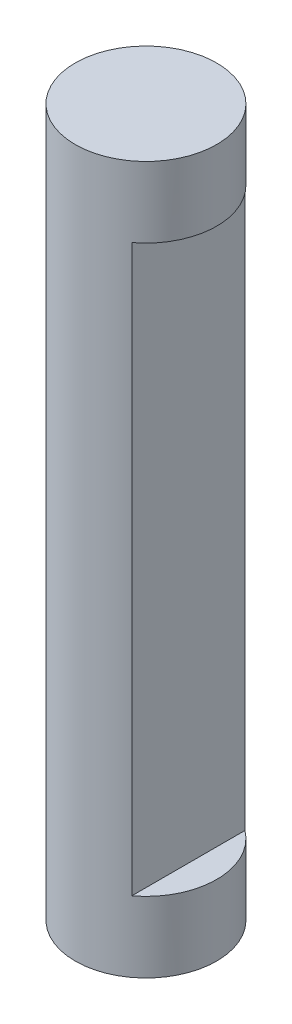
ISO-10303-21;
HEADER;
FILE_DESCRIPTION(('STEP AP214'),'2;1');
FILE_NAME('part.step','',(''),(''),'','','');
FILE_SCHEMA(('AUTOMOTIVE_DESIGN { 1 0 10303 214 1 1 1 1 }'));
ENDSEC;
DATA;
#1=APPLICATION_CONTEXT('core data for automotive mechanical design processes');
#2=APPLICATION_PROTOCOL_DEFINITION('international standard','automotive_design',2000,#1);
#3=PRODUCT_CONTEXT('',#1,'mechanical');
#4=PRODUCT('Part','Part','',(#3));
#5=PRODUCT_RELATED_PRODUCT_CATEGORY('part','',(#4));
#6=PRODUCT_DEFINITION_FORMATION('','',#4);
#7=PRODUCT_DEFINITION_CONTEXT('part definition',#1,'design');
#8=PRODUCT_DEFINITION('design','',#6,#7);
#9=PRODUCT_DEFINITION_SHAPE('','',#8);
#10=(LENGTH_UNIT() NAMED_UNIT(*) SI_UNIT(.MILLI.,.METRE.));
#11=(NAMED_UNIT(*) PLANE_ANGLE_UNIT() SI_UNIT($,.RADIAN.));
#12=(NAMED_UNIT(*) SI_UNIT($,.STERADIAN.) SOLID_ANGLE_UNIT());
#13=UNCERTAINTY_MEASURE_WITH_UNIT(LENGTH_MEASURE(1.E-05),#10,'distance_accuracy_value','');
#14=(GEOMETRIC_REPRESENTATION_CONTEXT(3) GLOBAL_UNCERTAINTY_ASSIGNED_CONTEXT((#13)) GLOBAL_UNIT_ASSIGNED_CONTEXT((#10,
#11,#12)) REPRESENTATION_CONTEXT('',''));
#15=CARTESIAN_POINT('',(0.,0.,0.));
#16=DIRECTION('',(0.,0.,1.));
#17=DIRECTION('',(1.,0.,0.));
#18=AXIS2_PLACEMENT_3D('',#15,#16,#17);
#19=CARTESIAN_POINT('',(0.,500.,0.));
#20=DIRECTION('',(0.,-1.,0.));
#21=DIRECTION('',(0.,0.,-1.));
#22=AXIS2_PLACEMENT_3D('',#19,#20,#21);
#23=CYLINDRICAL_SURFACE('',#22,50.);
#24=CARTESIAN_POINT('',(0.,450.,0.));
#25=DIRECTION('',(0.,-1.,0.));
#26=DIRECTION('',(0.,0.,-1.));
#27=AXIS2_PLACEMENT_3D('',#24,#25,#26);
#28=CIRCLE('',#27,50.);
#29=CARTESIAN_POINT('',(30.,450.,-40.));
#30=VERTEX_POINT('',#29);
#31=CARTESIAN_POINT('',(30.,450.,40.));
#32=VERTEX_POINT('',#31);
#33=EDGE_CURVE('E40',#30,#32,#28,.T.);
#34=ORIENTED_EDGE('',*,*,#33,.F.);
#35=DIRECTION('',(0.,-1.,0.));
#36=VECTOR('',#35,1.);
#37=CARTESIAN_POINT('',(30.,500.,-40.));
#38=LINE('',#37,#36);
#39=CARTESIAN_POINT('',(30.,50.,-40.));
#40=VERTEX_POINT('',#39);
#41=EDGE_CURVE('E11',#30,#40,#38,.T.);
#42=ORIENTED_EDGE('',*,*,#41,.T.);
#43=CARTESIAN_POINT('',(0.,50.,0.));
#44=DIRECTION('',(0.,1.,0.));
#45=DIRECTION('',(0.,0.,1.));
#46=AXIS2_PLACEMENT_3D('',#43,#44,#45);
#47=CIRCLE('',#46,50.);
#48=CARTESIAN_POINT('',(30.,50.,40.));
#49=VERTEX_POINT('',#48);
#50=EDGE_CURVE('E63',#49,#40,#47,.T.);
#51=ORIENTED_EDGE('',*,*,#50,.F.);
#52=DIRECTION('',(0.,-1.,0.));
#53=VECTOR('',#52,1.);
#54=CARTESIAN_POINT('',(30.,500.,40.));
#55=LINE('',#54,#53);
#56=EDGE_CURVE('E56',#49,#32,#55,.F.);
#57=ORIENTED_EDGE('',*,*,#56,.T.);
#58=EDGE_LOOP('',(#34,#42,#51,#57));
#59=FACE_BOUND('',#58,.T.);
#60=CARTESIAN_POINT('',(0.,500.,0.));
#61=DIRECTION('',(0.,1.,0.));
#62=DIRECTION('',(0.,0.,1.));
#63=AXIS2_PLACEMENT_3D('',#60,#61,#62);
#64=CIRCLE('',#63,50.);
#65=CARTESIAN_POINT('',(0.,500.,50.));
#66=VERTEX_POINT('',#65);
#67=EDGE_CURVE('E64',#66,#66,#64,.T.);
#68=ORIENTED_EDGE('',*,*,#67,.F.);
#69=EDGE_LOOP('',(#68));
#70=FACE_BOUND('',#69,.T.);
#71=CARTESIAN_POINT('',(0.,0.,0.));
#72=DIRECTION('',(0.,1.,0.));
#73=DIRECTION('',(0.,0.,1.));
#74=AXIS2_PLACEMENT_3D('',#71,#72,#73);
#75=CIRCLE('',#74,50.);
#76=CARTESIAN_POINT('',(0.,0.,50.));
#77=VERTEX_POINT('',#76);
#78=EDGE_CURVE('E73',#77,#77,#75,.T.);
#79=ORIENTED_EDGE('',*,*,#78,.T.);
#80=EDGE_LOOP('',(#79));
#81=FACE_BOUND('',#80,.T.);
#82=ADVANCED_FACE('F33',(#59,#70,#81),#23,.T.);
#83=CARTESIAN_POINT('',(0.,500.,0.));
#84=DIRECTION('',(0.,1.,0.));
#85=DIRECTION('',(0.,0.,1.));
#86=AXIS2_PLACEMENT_3D('',#83,#84,#85);
#87=PLANE('',#86);
#88=ORIENTED_EDGE('',*,*,#67,.T.);
#89=EDGE_LOOP('',(#88));
#90=FACE_BOUND('',#89,.T.);
#91=ADVANCED_FACE('F96',(#90),#87,.T.);
#92=CARTESIAN_POINT('',(0.,0.,0.));
#93=DIRECTION('',(0.,1.,0.));
#94=DIRECTION('',(0.,0.,1.));
#95=AXIS2_PLACEMENT_3D('',#92,#93,#94);
#96=PLANE('',#95);
#97=CARTESIAN_POINT('',(0.,0.,0.));
#98=DIRECTION('',(0.,-1.,0.));
#99=DIRECTION('',(0.,0.,-1.));
#100=AXIS2_PLACEMENT_3D('',#97,#98,#99);
#101=CIRCLE('',#100,25.);
#102=CARTESIAN_POINT('',(0.,0.,-25.));
#103=VERTEX_POINT('',#102);
#104=EDGE_CURVE('E68',#103,#103,#101,.T.);
#105=ORIENTED_EDGE('',*,*,#104,.F.);
#106=EDGE_LOOP('',(#105));
#107=FACE_BOUND('',#106,.T.);
#108=ORIENTED_EDGE('',*,*,#78,.F.);
#109=EDGE_LOOP('',(#108));
#110=FACE_BOUND('',#109,.T.);
#111=ADVANCED_FACE('F90',(#107,#110),#96,.F.);
#112=CARTESIAN_POINT('',(0.,20.,0.));
#113=DIRECTION('',(0.,-1.,0.));
#114=DIRECTION('',(0.,0.,-1.));
#115=AXIS2_PLACEMENT_3D('',#112,#113,#114);
#116=CYLINDRICAL_SURFACE('',#115,25.);
#117=CARTESIAN_POINT('',(0.,20.,0.));
#118=DIRECTION('',(0.,-1.,0.));
#119=DIRECTION('',(0.,0.,-1.));
#120=AXIS2_PLACEMENT_3D('',#117,#118,#119);
#121=CIRCLE('',#120,25.);
#122=CARTESIAN_POINT('',(0.,20.,-25.));
#123=VERTEX_POINT('',#122);
#124=EDGE_CURVE('E76',#123,#123,#121,.T.);
#125=ORIENTED_EDGE('',*,*,#124,.F.);
#126=EDGE_LOOP('',(#125));
#127=FACE_BOUND('',#126,.T.);
#128=ORIENTED_EDGE('',*,*,#104,.T.);
#129=EDGE_LOOP('',(#128));
#130=FACE_BOUND('',#129,.T.);
#131=ADVANCED_FACE('F87',(#127,#130),#116,.F.);
#132=CARTESIAN_POINT('',(0.,20.,0.));
#133=DIRECTION('',(0.,-1.,0.));
#134=DIRECTION('',(0.,0.,-1.));
#135=AXIS2_PLACEMENT_3D('',#132,#133,#134);
#136=PLANE('',#135);
#137=ORIENTED_EDGE('',*,*,#124,.T.);
#138=EDGE_LOOP('',(#137));
#139=FACE_BOUND('',#138,.T.);
#140=ADVANCED_FACE('F85',(#139),#136,.T.);
#141=CARTESIAN_POINT('',(80.,450.,100.));
#142=DIRECTION('',(0.,-1.,0.));
#143=DIRECTION('',(0.,0.,-1.));
#144=AXIS2_PLACEMENT_3D('',#141,#142,#143);
#145=PLANE('',#144);
#146=ORIENTED_EDGE('',*,*,#33,.T.);
#147=DIRECTION('',(0.,0.,1.));
#148=VECTOR('',#147,1.);
#149=CARTESIAN_POINT('',(30.,450.,100.));
#150=LINE('',#149,#148);
#151=EDGE_CURVE('E47',#30,#32,#150,.T.);
#152=ORIENTED_EDGE('',*,*,#151,.F.);
#153=EDGE_LOOP('',(#146,#152));
#154=FACE_BOUND('',#153,.T.);
#155=ADVANCED_FACE('F110',(#154),#145,.T.);
#156=CARTESIAN_POINT('',(80.,50.,100.));
#157=DIRECTION('',(0.,1.,0.));
#158=DIRECTION('',(0.,0.,1.));
#159=AXIS2_PLACEMENT_3D('',#156,#157,#158);
#160=PLANE('',#159);
#161=ORIENTED_EDGE('',*,*,#50,.T.);
#162=DIRECTION('',(0.,0.,-1.));
#163=VECTOR('',#162,1.);
#164=CARTESIAN_POINT('',(30.,50.,100.));
#165=LINE('',#164,#163);
#166=EDGE_CURVE('E59',#49,#40,#165,.T.);
#167=ORIENTED_EDGE('',*,*,#166,.F.);
#168=EDGE_LOOP('',(#161,#167));
#169=FACE_BOUND('',#168,.T.);
#170=ADVANCED_FACE('F67',(#169),#160,.T.);
#171=CARTESIAN_POINT('',(30.,0.,0.));
#172=DIRECTION('',(-1.,0.,0.));
#173=DIRECTION('',(0.,0.,1.));
#174=AXIS2_PLACEMENT_3D('',#171,#172,#173);
#175=PLANE('',#174);
#176=ORIENTED_EDGE('',*,*,#151,.T.);
#177=ORIENTED_EDGE('',*,*,#56,.F.);
#178=ORIENTED_EDGE('',*,*,#166,.T.);
#179=ORIENTED_EDGE('',*,*,#41,.F.);
#180=EDGE_LOOP('',(#176,#177,#178,#179));
#181=FACE_BOUND('',#180,.T.);
#182=ADVANCED_FACE('F58',(#181),#175,.F.);
#183=CLOSED_SHELL('',(#82,#91,#111,#131,#140,#155,#170,#182));
#184=MANIFOLD_SOLID_BREP('B2',#183);
#185=ADVANCED_BREP_SHAPE_REPRESENTATION('',(#18,#184),#14);
#186=SHAPE_DEFINITION_REPRESENTATION(#9,#185);
ENDSEC;
END-ISO-10303-21;
